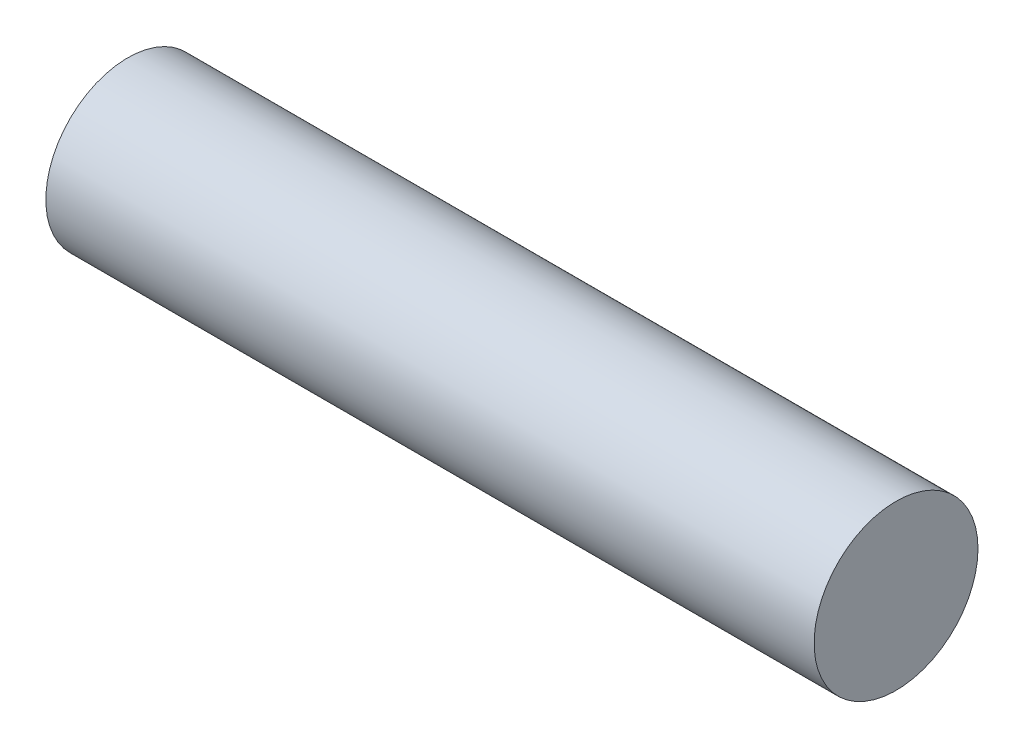
ISO-10303-21;
HEADER;
FILE_DESCRIPTION(('STEP AP214'),'2;1');
FILE_NAME('part.step','',(''),(''),'','','');
FILE_SCHEMA(('AUTOMOTIVE_DESIGN { 1 0 10303 214 1 1 1 1 }'));
ENDSEC;
DATA;
#1=APPLICATION_CONTEXT('core data for automotive mechanical design processes');
#2=APPLICATION_PROTOCOL_DEFINITION('international standard','automotive_design',2000,#1);
#3=PRODUCT_CONTEXT('',#1,'mechanical');
#4=PRODUCT('Part','Part','',(#3));
#5=PRODUCT_RELATED_PRODUCT_CATEGORY('part','',(#4));
#6=PRODUCT_DEFINITION_FORMATION('','',#4);
#7=PRODUCT_DEFINITION_CONTEXT('part definition',#1,'design');
#8=PRODUCT_DEFINITION('design','',#6,#7);
#9=PRODUCT_DEFINITION_SHAPE('','',#8);
#10=(LENGTH_UNIT() NAMED_UNIT(*) SI_UNIT(.MILLI.,.METRE.));
#11=(NAMED_UNIT(*) PLANE_ANGLE_UNIT() SI_UNIT($,.RADIAN.));
#12=(NAMED_UNIT(*) SI_UNIT($,.STERADIAN.) SOLID_ANGLE_UNIT());
#13=UNCERTAINTY_MEASURE_WITH_UNIT(LENGTH_MEASURE(1.E-05),#10,'distance_accuracy_value','');
#14=(GEOMETRIC_REPRESENTATION_CONTEXT(3) GLOBAL_UNCERTAINTY_ASSIGNED_CONTEXT((#13)) GLOBAL_UNIT_ASSIGNED_CONTEXT((#10,
#11,#12)) REPRESENTATION_CONTEXT('',''));
#15=CARTESIAN_POINT('',(0.,0.,0.));
#16=DIRECTION('',(0.,0.,1.));
#17=DIRECTION('',(1.,0.,0.));
#18=AXIS2_PLACEMENT_3D('',#15,#16,#17);
#19=CARTESIAN_POINT('',(7.5,0.,0.));
#20=DIRECTION('',(-1.,0.,0.));
#21=DIRECTION('',(0.,0.,1.));
#22=AXIS2_PLACEMENT_3D('',#19,#20,#21);
#23=CYLINDRICAL_SURFACE('',#22,1.6);
#24=CARTESIAN_POINT('',(7.5,0.,0.));
#25=DIRECTION('',(1.,0.,0.));
#26=DIRECTION('',(0.,0.,-1.));
#27=AXIS2_PLACEMENT_3D('',#24,#25,#26);
#28=CIRCLE('',#27,1.6);
#29=CARTESIAN_POINT('',(7.5,0.,-1.6));
#30=VERTEX_POINT('',#29);
#31=EDGE_CURVE('E10',#30,#30,#28,.T.);
#32=ORIENTED_EDGE('',*,*,#31,.F.);
#33=EDGE_LOOP('',(#32));
#34=FACE_BOUND('',#33,.T.);
#35=CARTESIAN_POINT('',(-7.5,0.,0.));
#36=DIRECTION('',(1.,0.,0.));
#37=DIRECTION('',(0.,0.,-1.));
#38=AXIS2_PLACEMENT_3D('',#35,#36,#37);
#39=CIRCLE('',#38,1.6);
#40=CARTESIAN_POINT('',(-7.5,0.,-1.6));
#41=VERTEX_POINT('',#40);
#42=EDGE_CURVE('E34',#41,#41,#39,.T.);
#43=ORIENTED_EDGE('',*,*,#42,.T.);
#44=EDGE_LOOP('',(#43));
#45=FACE_BOUND('',#44,.T.);
#46=ADVANCED_FACE('F31',(#34,#45),#23,.T.);
#47=CARTESIAN_POINT('',(7.5,0.,0.));
#48=DIRECTION('',(1.,0.,0.));
#49=DIRECTION('',(0.,0.,-1.));
#50=AXIS2_PLACEMENT_3D('',#47,#48,#49);
#51=PLANE('',#50);
#52=ORIENTED_EDGE('',*,*,#31,.T.);
#53=EDGE_LOOP('',(#52));
#54=FACE_BOUND('',#53,.T.);
#55=ADVANCED_FACE('F46',(#54),#51,.T.);
#56=CARTESIAN_POINT('',(-7.5,0.,0.));
#57=DIRECTION('',(1.,0.,0.));
#58=DIRECTION('',(0.,0.,-1.));
#59=AXIS2_PLACEMENT_3D('',#56,#57,#58);
#60=PLANE('',#59);
#61=ORIENTED_EDGE('',*,*,#42,.F.);
#62=EDGE_LOOP('',(#61));
#63=FACE_BOUND('',#62,.T.);
#64=ADVANCED_FACE('F44',(#63),#60,.F.);
#65=CLOSED_SHELL('',(#46,#55,#64));
#66=MANIFOLD_SOLID_BREP('B2',#65);
#67=ADVANCED_BREP_SHAPE_REPRESENTATION('',(#18,#66),#14);
#68=SHAPE_DEFINITION_REPRESENTATION(#9,#67);
ENDSEC;
END-ISO-10303-21;
